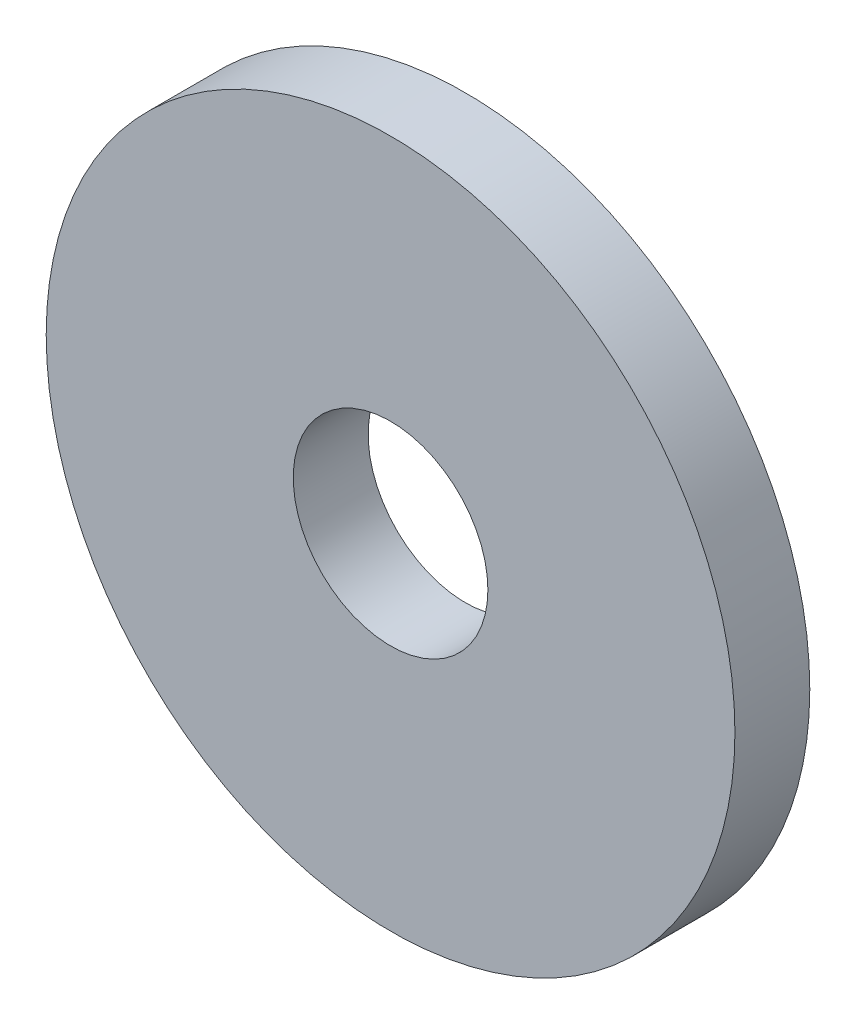
ISO-10303-21;
HEADER;
FILE_DESCRIPTION(('STEP AP214'),'2;1');
FILE_NAME('part.step','',(''),(''),'','','');
FILE_SCHEMA(('AUTOMOTIVE_DESIGN { 1 0 10303 214 1 1 1 1 }'));
ENDSEC;
DATA;
#1=APPLICATION_CONTEXT('core data for automotive mechanical design processes');
#2=APPLICATION_PROTOCOL_DEFINITION('international standard','automotive_design',2000,#1);
#3=PRODUCT_CONTEXT('',#1,'mechanical');
#4=PRODUCT('Part','Part','',(#3));
#5=PRODUCT_RELATED_PRODUCT_CATEGORY('part','',(#4));
#6=PRODUCT_DEFINITION_FORMATION('','',#4);
#7=PRODUCT_DEFINITION_CONTEXT('part definition',#1,'design');
#8=PRODUCT_DEFINITION('design','',#6,#7);
#9=PRODUCT_DEFINITION_SHAPE('','',#8);
#10=(LENGTH_UNIT() NAMED_UNIT(*) SI_UNIT(.MILLI.,.METRE.));
#11=(NAMED_UNIT(*) PLANE_ANGLE_UNIT() SI_UNIT($,.RADIAN.));
#12=(NAMED_UNIT(*) SI_UNIT($,.STERADIAN.) SOLID_ANGLE_UNIT());
#13=UNCERTAINTY_MEASURE_WITH_UNIT(LENGTH_MEASURE(1.E-05),#10,'distance_accuracy_value','');
#14=(GEOMETRIC_REPRESENTATION_CONTEXT(3) GLOBAL_UNCERTAINTY_ASSIGNED_CONTEXT((#13)) GLOBAL_UNIT_ASSIGNED_CONTEXT((#10,
#11,#12)) REPRESENTATION_CONTEXT('',''));
#15=CARTESIAN_POINT('',(0.,0.,0.));
#16=DIRECTION('',(0.,0.,1.));
#17=DIRECTION('',(1.,0.,0.));
#18=AXIS2_PLACEMENT_3D('',#15,#16,#17);
#19=CARTESIAN_POINT('',(0.,0.,5.));
#20=DIRECTION('',(0.,0.,1.));
#21=DIRECTION('',(1.,0.,0.));
#22=AXIS2_PLACEMENT_3D('',#19,#20,#21);
#23=PLANE('',#22);
#24=CARTESIAN_POINT('',(0.,0.,5.));
#25=DIRECTION('',(0.,0.,1.));
#26=DIRECTION('',(1.,0.,0.));
#27=AXIS2_PLACEMENT_3D('',#24,#25,#26);
#28=CIRCLE('',#27,23.);
#29=CARTESIAN_POINT('',(23.,0.,5.));
#30=VERTEX_POINT('',#29);
#31=EDGE_CURVE('E10',#30,#30,#28,.T.);
#32=ORIENTED_EDGE('',*,*,#31,.T.);
#33=EDGE_LOOP('',(#32));
#34=FACE_BOUND('',#33,.T.);
#35=CARTESIAN_POINT('',(0.,0.,5.));
#36=DIRECTION('',(0.,0.,1.));
#37=DIRECTION('',(1.,0.,0.));
#38=AXIS2_PLACEMENT_3D('',#35,#36,#37);
#39=CIRCLE('',#38,6.5);
#40=CARTESIAN_POINT('',(6.5,0.,5.));
#41=VERTEX_POINT('',#40);
#42=EDGE_CURVE('E42',#41,#41,#39,.T.);
#43=ORIENTED_EDGE('',*,*,#42,.F.);
#44=EDGE_LOOP('',(#43));
#45=FACE_BOUND('',#44,.T.);
#46=ADVANCED_FACE('F31',(#34,#45),#23,.T.);
#47=CARTESIAN_POINT('',(0.,0.,0.));
#48=DIRECTION('',(0.,0.,1.));
#49=DIRECTION('',(1.,0.,0.));
#50=AXIS2_PLACEMENT_3D('',#47,#48,#49);
#51=PLANE('',#50);
#52=CARTESIAN_POINT('',(0.,0.,0.));
#53=DIRECTION('',(0.,0.,1.));
#54=DIRECTION('',(1.,0.,0.));
#55=AXIS2_PLACEMENT_3D('',#52,#53,#54);
#56=CIRCLE('',#55,23.);
#57=CARTESIAN_POINT('',(23.,0.,0.));
#58=VERTEX_POINT('',#57);
#59=EDGE_CURVE('E35',#58,#58,#56,.T.);
#60=ORIENTED_EDGE('',*,*,#59,.F.);
#61=EDGE_LOOP('',(#60));
#62=FACE_BOUND('',#61,.T.);
#63=CARTESIAN_POINT('',(0.,0.,0.));
#64=DIRECTION('',(0.,0.,1.));
#65=DIRECTION('',(1.,0.,0.));
#66=AXIS2_PLACEMENT_3D('',#63,#64,#65);
#67=CIRCLE('',#66,6.5);
#68=CARTESIAN_POINT('',(6.5,0.,0.));
#69=VERTEX_POINT('',#68);
#70=EDGE_CURVE('E44',#69,#69,#67,.T.);
#71=ORIENTED_EDGE('',*,*,#70,.T.);
#72=EDGE_LOOP('',(#71));
#73=FACE_BOUND('',#72,.T.);
#74=ADVANCED_FACE('F54',(#62,#73),#51,.F.);
#75=CARTESIAN_POINT('',(0.,0.,5.));
#76=DIRECTION('',(0.,0.,-1.));
#77=DIRECTION('',(-1.,0.,0.));
#78=AXIS2_PLACEMENT_3D('',#75,#76,#77);
#79=CYLINDRICAL_SURFACE('',#78,23.);
#80=ORIENTED_EDGE('',*,*,#31,.F.);
#81=EDGE_LOOP('',(#80));
#82=FACE_BOUND('',#81,.T.);
#83=ORIENTED_EDGE('',*,*,#59,.T.);
#84=EDGE_LOOP('',(#83));
#85=FACE_BOUND('',#84,.T.);
#86=ADVANCED_FACE('F33',(#82,#85),#79,.T.);
#87=CARTESIAN_POINT('',(0.,0.,5.));
#88=DIRECTION('',(0.,0.,-1.));
#89=DIRECTION('',(-1.,0.,0.));
#90=AXIS2_PLACEMENT_3D('',#87,#88,#89);
#91=CYLINDRICAL_SURFACE('',#90,6.5);
#92=ORIENTED_EDGE('',*,*,#42,.T.);
#93=EDGE_LOOP('',(#92));
#94=FACE_BOUND('',#93,.T.);
#95=ORIENTED_EDGE('',*,*,#70,.F.);
#96=EDGE_LOOP('',(#95));
#97=FACE_BOUND('',#96,.T.);
#98=ADVANCED_FACE('F50',(#94,#97),#91,.F.);
#99=CLOSED_SHELL('',(#46,#74,#86,#98));
#100=MANIFOLD_SOLID_BREP('B2',#99);
#101=ADVANCED_BREP_SHAPE_REPRESENTATION('',(#18,#100),#14);
#102=SHAPE_DEFINITION_REPRESENTATION(#9,#101);
ENDSEC;
END-ISO-10303-21;
